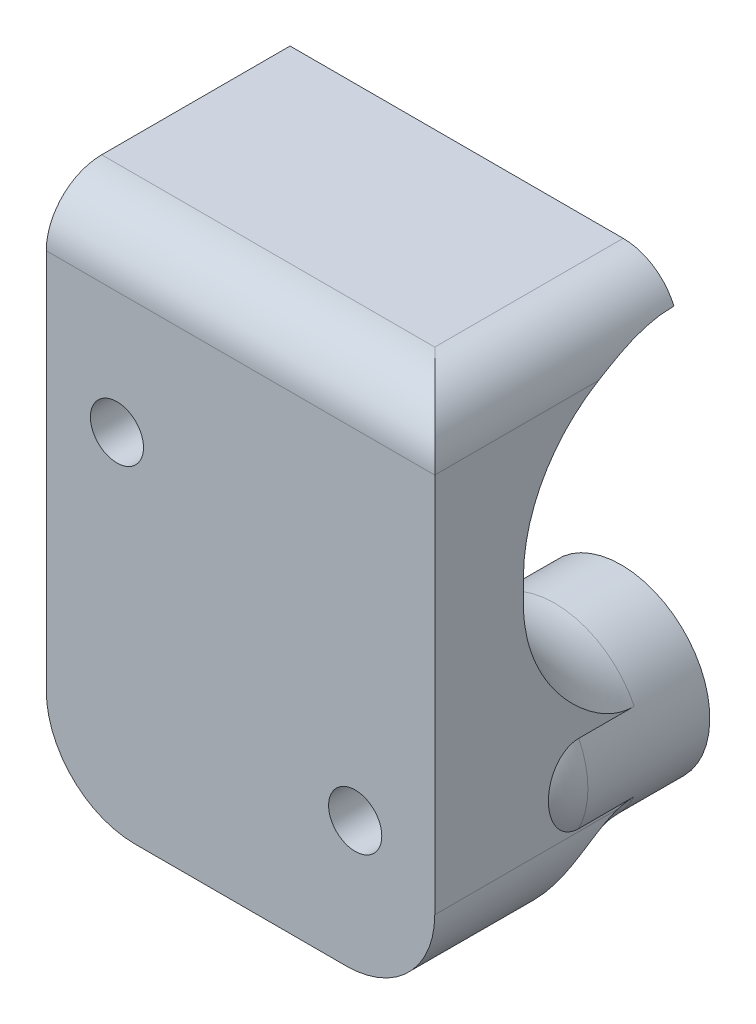
ISO-10303-21;
HEADER;
FILE_DESCRIPTION(('STEP AP214'),'2;1');
FILE_NAME('part.step','',(''),(''),'','','');
FILE_SCHEMA(('AUTOMOTIVE_DESIGN { 1 0 10303 214 1 1 1 1 }'));
ENDSEC;
DATA;
#1=APPLICATION_CONTEXT('core data for automotive mechanical design processes');
#2=APPLICATION_PROTOCOL_DEFINITION('international standard','automotive_design',2000,#1);
#3=PRODUCT_CONTEXT('',#1,'mechanical');
#4=PRODUCT('Part','Part','',(#3));
#5=PRODUCT_RELATED_PRODUCT_CATEGORY('part','',(#4));
#6=PRODUCT_DEFINITION_FORMATION('','',#4);
#7=PRODUCT_DEFINITION_CONTEXT('part definition',#1,'design');
#8=PRODUCT_DEFINITION('design','',#6,#7);
#9=PRODUCT_DEFINITION_SHAPE('','',#8);
#10=(LENGTH_UNIT() NAMED_UNIT(*) SI_UNIT(.MILLI.,.METRE.));
#11=(NAMED_UNIT(*) PLANE_ANGLE_UNIT() SI_UNIT($,.RADIAN.));
#12=(NAMED_UNIT(*) SI_UNIT($,.STERADIAN.) SOLID_ANGLE_UNIT());
#13=UNCERTAINTY_MEASURE_WITH_UNIT(LENGTH_MEASURE(1.E-05),#10,'distance_accuracy_value','');
#14=(GEOMETRIC_REPRESENTATION_CONTEXT(3) GLOBAL_UNCERTAINTY_ASSIGNED_CONTEXT((#13)) GLOBAL_UNIT_ASSIGNED_CONTEXT((#10,
#11,#12)) REPRESENTATION_CONTEXT('',''));
#15=CARTESIAN_POINT('',(0.,0.,0.));
#16=DIRECTION('',(0.,0.,1.));
#17=DIRECTION('',(1.,0.,0.));
#18=AXIS2_PLACEMENT_3D('',#15,#16,#17);
#19=CARTESIAN_POINT('',(0.,0.,4.));
#20=DIRECTION('',(0.,0.,-1.));
#21=DIRECTION('',(-1.,0.,0.));
#22=AXIS2_PLACEMENT_3D('',#19,#20,#21);
#23=PLANE('',#22);
#24=DIRECTION('',(0.,1.,0.));
#25=VECTOR('',#24,1.);
#26=CARTESIAN_POINT('',(19.7293652888547,1.24866858143758,4.));
#27=LINE('',#26,#25);
#28=CARTESIAN_POINT('',(19.7293652888547,5.24866858143758,4.));
#29=VERTEX_POINT('',#28);
#30=CARTESIAN_POINT('',(19.7293652888547,22.4296617706878,4.));
#31=VERTEX_POINT('',#30);
#32=EDGE_CURVE('E183',#29,#31,#27,.T.);
#33=ORIENTED_EDGE('',*,*,#32,.T.);
#34=DIRECTION('',(-1.,0.,0.));
#35=VECTOR('',#34,1.);
#36=CARTESIAN_POINT('',(0.,22.4296617706878,4.));
#37=LINE('',#36,#35);
#38=CARTESIAN_POINT('',(2.20085117670349,22.4296617706878,4.));
#39=VERTEX_POINT('',#38);
#40=EDGE_CURVE('E45',#31,#39,#37,.T.);
#41=ORIENTED_EDGE('',*,*,#40,.T.);
#42=DIRECTION('',(0.,-1.,0.));
#43=VECTOR('',#42,1.);
#44=CARTESIAN_POINT('',(2.20085117670349,1.24866858143758,4.));
#45=LINE('',#44,#43);
#46=CARTESIAN_POINT('',(2.20085117670349,5.24866858143758,4.));
#47=VERTEX_POINT('',#46);
#48=EDGE_CURVE('E177',#39,#47,#45,.T.);
#49=ORIENTED_EDGE('',*,*,#48,.T.);
#50=CARTESIAN_POINT('',(6.20085117670349,5.24866858143758,4.));
#51=DIRECTION('',(0.,0.,-1.));
#52=DIRECTION('',(-1.,0.,0.));
#53=AXIS2_PLACEMENT_3D('',#50,#51,#52);
#54=CIRCLE('',#53,4.);
#55=CARTESIAN_POINT('',(6.20085117670349,1.24866858143758,4.));
#56=VERTEX_POINT('',#55);
#57=EDGE_CURVE('E205',#47,#56,#54,.F.);
#58=ORIENTED_EDGE('',*,*,#57,.T.);
#59=DIRECTION('',(1.,0.,0.));
#60=VECTOR('',#59,1.);
#61=CARTESIAN_POINT('',(2.20085117670349,1.24866858143758,4.));
#62=LINE('',#61,#60);
#63=CARTESIAN_POINT('',(15.7293652888547,1.24866858143758,4.));
#64=VERTEX_POINT('',#63);
#65=EDGE_CURVE('E179',#56,#64,#62,.T.);
#66=ORIENTED_EDGE('',*,*,#65,.T.);
#67=CARTESIAN_POINT('',(15.7293652888547,5.24866858143758,4.));
#68=DIRECTION('',(0.,0.,-1.));
#69=DIRECTION('',(-1.,0.,0.));
#70=AXIS2_PLACEMENT_3D('',#67,#68,#69);
#71=CIRCLE('',#70,4.);
#72=EDGE_CURVE('E203',#64,#29,#71,.F.);
#73=ORIENTED_EDGE('',*,*,#72,.T.);
#74=EDGE_LOOP('',(#33,#41,#49,#58,#66,#73));
#75=FACE_BOUND('',#74,.T.);
#76=CARTESIAN_POINT('',(16.1393652888547,7.12966177068777,4.));
#77=DIRECTION('',(0.,0.,1.));
#78=DIRECTION('',(1.,0.,0.));
#79=AXIS2_PLACEMENT_3D('',#76,#77,#78);
#80=CIRCLE('',#79,1.2);
#81=CARTESIAN_POINT('',(17.3393652888547,7.12966177068777,4.));
#82=VERTEX_POINT('',#81);
#83=EDGE_CURVE('E171',#82,#82,#80,.T.);
#84=ORIENTED_EDGE('',*,*,#83,.F.);
#85=EDGE_LOOP('',(#84));
#86=FACE_BOUND('',#85,.T.);
#87=CARTESIAN_POINT('',(5.39085117670349,16.9296617706878,4.));
#88=DIRECTION('',(0.,0.,1.));
#89=DIRECTION('',(1.,0.,0.));
#90=AXIS2_PLACEMENT_3D('',#87,#88,#89);
#91=CIRCLE('',#90,1.19774028703024);
#92=CARTESIAN_POINT('',(6.58859146373373,16.9296617706878,4.));
#93=VERTEX_POINT('',#92);
#94=EDGE_CURVE('E165',#93,#93,#91,.T.);
#95=ORIENTED_EDGE('',*,*,#94,.F.);
#96=EDGE_LOOP('',(#95));
#97=FACE_BOUND('',#96,.T.);
#98=ADVANCED_FACE('F36',(#75,#86,#97),#23,.F.);
#99=CARTESIAN_POINT('',(0.,0.,0.));
#100=DIRECTION('',(0.,0.,-1.));
#101=DIRECTION('',(-1.,0.,0.));
#102=AXIS2_PLACEMENT_3D('',#99,#100,#101);
#103=PLANE('',#102);
#104=DIRECTION('',(0.,-1.,0.));
#105=VECTOR('',#104,1.);
#106=CARTESIAN_POINT('',(2.20085117670349,1.24866858143758,0.));
#107=LINE('',#106,#105);
#108=CARTESIAN_POINT('',(2.20085117670349,16.4296617706878,0.));
#109=VERTEX_POINT('',#108);
#110=CARTESIAN_POINT('',(2.20085117670349,5.24866858143758,0.));
#111=VERTEX_POINT('',#110);
#112=EDGE_CURVE('E174',#109,#111,#107,.T.);
#113=ORIENTED_EDGE('',*,*,#112,.F.);
#114=DIRECTION('',(-1.,0.,0.));
#115=VECTOR('',#114,1.);
#116=CARTESIAN_POINT('',(0.,16.4296617706878,0.));
#117=LINE('',#116,#115);
#118=CARTESIAN_POINT('',(4.30246622863811,16.4296617706878,0.));
#119=VERTEX_POINT('',#118);
#120=EDGE_CURVE('E151',#109,#119,#117,.F.);
#121=ORIENTED_EDGE('',*,*,#120,.T.);
#122=CARTESIAN_POINT('',(5.39085117670349,16.9296617706878,0.));
#123=DIRECTION('',(0.,0.,1.));
#124=DIRECTION('',(1.,0.,0.));
#125=AXIS2_PLACEMENT_3D('',#122,#123,#124);
#126=CIRCLE('',#125,1.19774028703024);
#127=CARTESIAN_POINT('',(6.47923612476887,16.4296617706878,0.));
#128=VERTEX_POINT('',#127);
#129=EDGE_CURVE('E161',#119,#128,#126,.T.);
#130=ORIENTED_EDGE('',*,*,#129,.T.);
#131=DIRECTION('',(-1.,0.,0.));
#132=VECTOR('',#131,1.);
#133=CARTESIAN_POINT('',(0.,16.4296617706878,0.));
#134=LINE('',#133,#132);
#135=CARTESIAN_POINT('',(19.7293652888547,16.4296617706878,0.));
#136=VERTEX_POINT('',#135);
#137=EDGE_CURVE('E266',#128,#136,#134,.F.);
#138=ORIENTED_EDGE('',*,*,#137,.T.);
#139=DIRECTION('',(0.,1.,0.));
#140=VECTOR('',#139,1.);
#141=CARTESIAN_POINT('',(19.7293652888547,1.24866858143758,0.));
#142=LINE('',#141,#140);
#143=CARTESIAN_POINT('',(19.7293652888547,15.3826551670258,0.));
#144=VERTEX_POINT('',#143);
#145=EDGE_CURVE('E180',#144,#136,#142,.T.);
#146=ORIENTED_EDGE('',*,*,#145,.F.);
#147=CARTESIAN_POINT('',(16.1393652888547,7.12966177068777,0.));
#148=DIRECTION('',(0.,0.,-1.));
#149=DIRECTION('',(-1.,0.,0.));
#150=AXIS2_PLACEMENT_3D('',#147,#148,#149);
#151=CIRCLE('',#150,9.);
#152=CARTESIAN_POINT('',(9.32658912138871,1.24866858143758,0.));
#153=VERTEX_POINT('',#152);
#154=EDGE_CURVE('E217',#144,#153,#151,.F.);
#155=ORIENTED_EDGE('',*,*,#154,.T.);
#156=DIRECTION('',(1.,0.,0.));
#157=VECTOR('',#156,1.);
#158=CARTESIAN_POINT('',(2.20085117670349,1.24866858143758,0.));
#159=LINE('',#158,#157);
#160=CARTESIAN_POINT('',(6.20085117670349,1.24866858143758,0.));
#161=VERTEX_POINT('',#160);
#162=EDGE_CURVE('E186',#161,#153,#159,.T.);
#163=ORIENTED_EDGE('',*,*,#162,.F.);
#164=CARTESIAN_POINT('',(6.20085117670349,5.24866858143758,0.));
#165=DIRECTION('',(0.,0.,-1.));
#166=DIRECTION('',(-1.,0.,0.));
#167=AXIS2_PLACEMENT_3D('',#164,#165,#166);
#168=CIRCLE('',#167,4.);
#169=EDGE_CURVE('E197',#161,#111,#168,.T.);
#170=ORIENTED_EDGE('',*,*,#169,.T.);
#171=EDGE_LOOP('',(#113,#121,#130,#138,#146,#155,#163,#170));
#172=FACE_BOUND('',#171,.T.);
#173=ADVANCED_FACE('F291',(#172),#103,.T.);
#174=CARTESIAN_POINT('',(2.20085117670349,1.24866858143758,4.));
#175=DIRECTION('',(1.,0.,0.));
#176=DIRECTION('',(0.,0.,-1.));
#177=AXIS2_PLACEMENT_3D('',#174,#175,#176);
#178=PLANE('',#177);
#179=ORIENTED_EDGE('',*,*,#48,.F.);
#180=CARTESIAN_POINT('',(2.20085117670349,22.4296617706878,1.5));
#181=DIRECTION('',(1.,0.,0.));
#182=DIRECTION('',(0.,0.,-1.));
#183=AXIS2_PLACEMENT_3D('',#180,#181,#182);
#184=CIRCLE('',#183,2.5);
#185=CARTESIAN_POINT('',(2.20085117670349,24.9296617706878,1.5));
#186=VERTEX_POINT('',#185);
#187=EDGE_CURVE('E11',#39,#186,#184,.F.);
#188=ORIENTED_EDGE('',*,*,#187,.T.);
#189=DIRECTION('',(0.,0.,-1.));
#190=VECTOR('',#189,1.);
#191=CARTESIAN_POINT('',(2.20085117670349,24.9296617706878,4.));
#192=LINE('',#191,#190);
#193=CARTESIAN_POINT('',(2.20085117670349,24.9296617706878,-7.));
#194=VERTEX_POINT('',#193);
#195=EDGE_CURVE('E158',#186,#194,#192,.T.);
#196=ORIENTED_EDGE('',*,*,#195,.T.);
#197=DIRECTION('',(0.,1.,0.));
#198=VECTOR('',#197,1.);
#199=CARTESIAN_POINT('',(2.20085117670349,24.9296617706878,-7.));
#200=LINE('',#199,#198);
#201=CARTESIAN_POINT('',(2.20085117670349,23.4296617706878,-7.));
#202=VERTEX_POINT('',#201);
#203=EDGE_CURVE('E140',#202,#194,#200,.T.);
#204=ORIENTED_EDGE('',*,*,#203,.F.);
#205=CARTESIAN_POINT('',(2.20085117670349,16.4296617706878,-7.));
#206=DIRECTION('',(1.,0.,0.));
#207=DIRECTION('',(0.,0.,-1.));
#208=AXIS2_PLACEMENT_3D('',#205,#206,#207);
#209=CIRCLE('',#208,7.);
#210=EDGE_CURVE('E148',#202,#109,#209,.T.);
#211=ORIENTED_EDGE('',*,*,#210,.T.);
#212=ORIENTED_EDGE('',*,*,#112,.T.);
#213=DIRECTION('',(0.,0.,-1.));
#214=VECTOR('',#213,1.);
#215=CARTESIAN_POINT('',(2.20085117670349,5.24866858143758,4.));
#216=LINE('',#215,#214);
#217=EDGE_CURVE('E200',#111,#47,#216,.F.);
#218=ORIENTED_EDGE('',*,*,#217,.T.);
#219=EDGE_LOOP('',(#179,#188,#196,#204,#211,#212,#218));
#220=FACE_BOUND('',#219,.T.);
#221=ADVANCED_FACE('F156',(#220),#178,.F.);
#222=CARTESIAN_POINT('',(2.20085117670349,1.24866858143758,4.));
#223=DIRECTION('',(0.,1.,0.));
#224=DIRECTION('',(0.,0.,1.));
#225=AXIS2_PLACEMENT_3D('',#222,#223,#224);
#226=PLANE('',#225);
#227=ORIENTED_EDGE('',*,*,#65,.F.);
#228=DIRECTION('',(0.,0.,-1.));
#229=VECTOR('',#228,1.);
#230=CARTESIAN_POINT('',(6.20085117670349,1.24866858143758,4.));
#231=LINE('',#230,#229);
#232=EDGE_CURVE('E194',#56,#161,#231,.T.);
#233=ORIENTED_EDGE('',*,*,#232,.T.);
#234=ORIENTED_EDGE('',*,*,#162,.T.);
#235=CARTESIAN_POINT('',(9.32658912138871,1.24866858143758,0.));
#236=CARTESIAN_POINT('',(9.54555628879853,1.24866858143758,4.20623398602795E-05));
#237=CARTESIAN_POINT('',(9.76435706845119,1.24866858143758,-0.00823480648782743));
#238=CARTESIAN_POINT('',(10.2005797246538,1.24866858143758,-0.039056109352053));
#239=CARTESIAN_POINT('',(10.4180033766736,1.24866858143758,-0.0615747778262042));
#240=CARTESIAN_POINT('',(10.8509060792367,1.24866858143758,-0.118484839648181));
#241=CARTESIAN_POINT('',(11.0663874936383,1.24866858143758,-0.152858958210626));
#242=CARTESIAN_POINT('',(11.4957606697991,1.24866858143758,-0.230884004024369));
#243=CARTESIAN_POINT('',(11.7096514194769,1.24866858143758,-0.274540388506163));
#244=CARTESIAN_POINT('',(12.0806091395052,1.24866858143758,-0.356015098310026));
#245=CARTESIAN_POINT('',(12.2379983971854,1.24866858143758,-0.392402354746776));
#246=CARTESIAN_POINT('',(12.5522707060738,1.24866858143758,-0.467309792661472));
#247=CARTESIAN_POINT('',(12.7091537377214,1.24866858143758,-0.505830055538854));
#248=CARTESIAN_POINT('',(13.0226320132369,1.24866858143758,-0.583486809110885));
#249=CARTESIAN_POINT('',(13.1792273867061,1.24866858143758,-0.622622786191575));
#250=CARTESIAN_POINT('',(13.4926914146475,1.24866858143758,-0.699877045574316));
#251=CARTESIAN_POINT('',(13.6495600975953,1.24866858143758,-0.737995214125289));
#252=CARTESIAN_POINT('',(13.9646465059077,1.24866858143758,-0.811492738592579));
#253=CARTESIAN_POINT('',(14.122867130177,1.24866858143758,-0.846859910175811));
#254=CARTESIAN_POINT('',(14.4402962832324,1.24866858143758,-0.912591306901972));
#255=CARTESIAN_POINT('',(14.5995043791527,1.24866858143758,-0.942957582773081));
#256=CARTESIAN_POINT('',(14.9197713752915,1.24866858143758,-0.996674459515918));
#257=CARTESIAN_POINT('',(15.0808350375287,1.24866858143758,-1.01999764297659));
#258=CARTESIAN_POINT('',(15.3233425081727,1.24866858143758,-1.04816159680771));
#259=CARTESIAN_POINT('',(15.4043935495477,1.24866858143758,-1.05641652724594));
#260=CARTESIAN_POINT('',(15.5667245444592,1.24866858143758,-1.07046616809496));
#261=CARTESIAN_POINT('',(15.6480045417261,1.24866858143758,-1.07626037117464));
#262=CARTESIAN_POINT('',(15.7293652888547,1.24866858143758,-1.08073512577365));
#263=B_SPLINE_CURVE_WITH_KNOTS('',3,(#235,#236,#237,#238,#239,#240,#241,#242,#243,#244,#245,
#246,#247,#248,#249,#250,#251,#252,#253,#254,#255,#256,#257,#258,#259,#260,#261,#262),
.UNSPECIFIED.,.F.,.F.,(4,2,2,2,2,2,2,2,2,2,2,2,2,4),(0.,0.656502651360714,1.31182097476802,
1.96618842850163,2.62094166706982,3.10554479689278,3.59016643282155,4.07440324732763,
4.5586939559018,5.04502009687463,5.53114630975148,6.01914122223986,6.26351807298325,
6.5079452827649),.UNSPECIFIED.);
#264=CARTESIAN_POINT('',(15.7293652888547,1.24866858143758,-1.08073512577365));
#265=VERTEX_POINT('',#264);
#266=EDGE_CURVE('E227',#153,#265,#263,.T.);
#267=ORIENTED_EDGE('',*,*,#266,.T.);
#268=DIRECTION('',(0.,0.,-1.));
#269=VECTOR('',#268,1.);
#270=CARTESIAN_POINT('',(15.7293652888547,1.24866858143758,4.));
#271=LINE('',#270,#269);
#272=EDGE_CURVE('E192',#265,#64,#271,.F.);
#273=ORIENTED_EDGE('',*,*,#272,.T.);
#274=EDGE_LOOP('',(#227,#233,#234,#267,#273));
#275=FACE_BOUND('',#274,.T.);
#276=ADVANCED_FACE('F299',(#275),#226,.F.);
#277=CARTESIAN_POINT('',(19.7293652888547,1.24866858143758,4.));
#278=DIRECTION('',(-1.,0.,0.));
#279=DIRECTION('',(0.,0.,1.));
#280=AXIS2_PLACEMENT_3D('',#277,#278,#279);
#281=PLANE('',#280);
#282=CARTESIAN_POINT('',(19.7293652888547,16.4296617706878,-7.));
#283=DIRECTION('',(-1.,0.,0.));
#284=DIRECTION('',(0.,0.,1.));
#285=AXIS2_PLACEMENT_3D('',#282,#283,#284);
#286=CIRCLE('',#285,7.);
#287=CARTESIAN_POINT('',(19.7293652888547,22.4296617706878,-3.39444872453601));
#288=VERTEX_POINT('',#287);
#289=EDGE_CURVE('E275',#136,#288,#286,.T.);
#290=ORIENTED_EDGE('',*,*,#289,.T.);
#291=DIRECTION('',(0.,0.,-1.));
#292=VECTOR('',#291,1.);
#293=CARTESIAN_POINT('',(19.7293652888547,22.4296617706878,4.));
#294=LINE('',#293,#292);
#295=EDGE_CURVE('E59',#288,#31,#294,.F.);
#296=ORIENTED_EDGE('',*,*,#295,.T.);
#297=ORIENTED_EDGE('',*,*,#32,.F.);
#298=DIRECTION('',(0.,0.,-1.));
#299=VECTOR('',#298,1.);
#300=CARTESIAN_POINT('',(19.7293652888547,5.24866858143758,4.));
#301=LINE('',#300,#299);
#302=CARTESIAN_POINT('',(19.7293652888547,5.24866858143758,-4.27440311544236));
#303=VERTEX_POINT('',#302);
#304=EDGE_CURVE('E207',#29,#303,#301,.T.);
#305=ORIENTED_EDGE('',*,*,#304,.T.);
#306=CARTESIAN_POINT('',(19.7293652888547,5.24866858143758,-4.27440311544236));
#307=CARTESIAN_POINT('',(19.7293652888547,5.2672559076425,-4.33318068845502));
#308=CARTESIAN_POINT('',(19.7293652888547,5.28393120337881,-4.39259549726452));
#309=CARTESIAN_POINT('',(19.7293652888547,5.31289901896801,-4.51210667490693));
#310=CARTESIAN_POINT('',(19.7293652888547,5.32521689843051,-4.572196927296));
#311=CARTESIAN_POINT('',(19.7293652888547,5.3451442158191,-4.69317974423206));
#312=CARTESIAN_POINT('',(19.7293652888547,5.35275270791755,-4.75407246743996));
#313=CARTESIAN_POINT('',(19.7293652888547,5.36301550366716,-4.87663577129248));
#314=CARTESIAN_POINT('',(19.7293652888547,5.36564005702666,-4.93830882447122));
#315=CARTESIAN_POINT('',(19.7293652888547,5.36560394850595,-5.00000000000008));
#316=B_SPLINE_CURVE_WITH_KNOTS('',3,(#306,#307,#308,#309,#310,#311,#312,#313,#314,#315),
.UNSPECIFIED.,.F.,.F.,(4,2,2,2,4),(0.,0.184953075098565,0.368811317016596,0.552706472829413,
0.737695932796255),.UNSPECIFIED.);
#317=CARTESIAN_POINT('',(19.7293652888547,5.3656039485062,-5.));
#318=VERTEX_POINT('',#317);
#319=EDGE_CURVE('E259',#303,#318,#316,.T.);
#320=ORIENTED_EDGE('',*,*,#319,.T.);
#321=DIRECTION('',(0.,0.,1.));
#322=VECTOR('',#321,1.);
#323=CARTESIAN_POINT('',(19.7293652888547,5.3656039485062,0.));
#324=LINE('',#323,#322);
#325=CARTESIAN_POINT('',(19.7293652888547,5.3656039485062,-2.5));
#326=VERTEX_POINT('',#325);
#327=EDGE_CURVE('E209',#326,#318,#324,.F.);
#328=ORIENTED_EDGE('',*,*,#327,.F.);
#329=CARTESIAN_POINT('',(19.7293652888547,5.3656039485062,-2.5));
#330=CARTESIAN_POINT('',(19.7293652888547,5.36559865556175,-2.46229175998775));
#331=CARTESIAN_POINT('',(19.7293652888547,5.36754038245088,-2.4246102752985));
#332=CARTESIAN_POINT('',(19.7293652888547,5.37524195353578,-2.34966535888322));
#333=CARTESIAN_POINT('',(19.7293652888547,5.38099914258456,-2.31240165475239));
#334=CARTESIAN_POINT('',(19.7293652888547,5.40374538918709,-2.20237630310146));
#335=CARTESIAN_POINT('',(19.7293652888547,5.42621236156184,-2.13068206071386));
#336=CARTESIAN_POINT('',(19.7293652888547,5.48415536722237,-1.99306802319238));
#337=CARTESIAN_POINT('',(19.7293652888547,5.5196040587472,-1.92713644978367));
#338=CARTESIAN_POINT('',(19.7293652888547,5.6014326249231,-1.80238203032851));
#339=CARTESIAN_POINT('',(19.7293652888547,5.64782789157216,-1.74356937200913));
#340=CARTESIAN_POINT('',(19.7293652888547,5.74730039013117,-1.63618346307512));
#341=CARTESIAN_POINT('',(19.7293652888547,5.80004817125829,-1.58730127190067));
#342=CARTESIAN_POINT('',(19.7293652888547,5.91172413351117,-1.49725432143782));
#343=CARTESIAN_POINT('',(19.7293652888547,5.97065436910791,-1.45609214030841));
#344=CARTESIAN_POINT('',(19.7293652888547,6.12415088243007,-1.36252307465462));
#345=CARTESIAN_POINT('',(19.7293652888547,6.22167460334327,-1.31494778787668));
#346=CARTESIAN_POINT('',(19.7293652888547,6.42311763178275,-1.23625388641613));
#347=CARTESIAN_POINT('',(19.7293652888547,6.52704469907529,-1.20515569511546));
#348=CARTESIAN_POINT('',(19.7293652888547,6.71419155032046,-1.16379973889964));
#349=CARTESIAN_POINT('',(19.7293652888547,6.79674222557573,-1.15041001578762));
#350=CARTESIAN_POINT('',(19.7293652888547,6.96274075819934,-1.13260204409007));
#351=CARTESIAN_POINT('',(19.7293652888547,7.04618803369664,-1.12817829314361));
#352=CARTESIAN_POINT('',(19.7293652888547,7.24619644301057,-1.12817374789229));
#353=CARTESIAN_POINT('',(19.7293652888547,7.36278268863695,-1.13678926853371));
#354=CARTESIAN_POINT('',(19.7293652888547,7.59353832414797,-1.17168674638339));
#355=CARTESIAN_POINT('',(19.7293652888547,7.70770287034339,-1.19800119281276));
#356=CARTESIAN_POINT('',(19.7293652888547,7.9311072443394,-1.26970131442237));
#357=CARTESIAN_POINT('',(19.7293652888547,8.04029545507909,-1.31525126996584));
#358=CARTESIAN_POINT('',(19.7293652888547,8.24766351986045,-1.42671029809274));
#359=CARTESIAN_POINT('',(19.7293652888547,8.34587941021617,-1.49254988457889));
#360=CARTESIAN_POINT('',(19.7293652888547,8.49240150863878,-1.61728976094126));
#361=CARTESIAN_POINT('',(19.7293652888547,8.54591801678643,-1.67010037032794));
#362=CARTESIAN_POINT('',(19.7293652888547,8.64371313682637,-1.78376233491642));
#363=CARTESIAN_POINT('',(19.7293652888547,8.68799454630481,-1.84461124592729));
#364=CARTESIAN_POINT('',(19.7293652888547,8.76534711277782,-1.97380736493008));
#365=CARTESIAN_POINT('',(19.7293652888547,8.79832203213034,-2.04221269402204));
#366=CARTESIAN_POINT('',(19.7293652888547,8.85034509371521,-2.18408914858955));
#367=CARTESIAN_POINT('',(19.7293652888547,8.86942427549188,-2.25754857993438));
#368=CARTESIAN_POINT('',(19.7293652888547,8.88514980371624,-2.35985901750131));
#369=CARTESIAN_POINT('',(19.7293652888547,8.88836114827594,-2.38780653090368));
#370=CARTESIAN_POINT('',(19.7293652888547,8.89264400875459,-2.4438304179339));
#371=CARTESIAN_POINT('',(19.7293652888547,8.89371815155329,-2.47190659080516));
#372=CARTESIAN_POINT('',(19.7293652888547,8.89371959286934,-2.5));
#373=B_SPLINE_CURVE_WITH_KNOTS('',3,(#329,#330,#331,#332,#333,#334,#335,#336,#337,#338,#339,
#340,#341,#342,#343,#344,#345,#346,#347,#348,#349,#350,#351,#352,#353,#354,#355,#356,#357,#358,
#359,#360,#361,#362,#363,#364,#365,#366,#367,#368,#369,#370,#371,#372),.UNSPECIFIED.,.F.,.F.,(4,
2,2,2,2,2,2,2,2,2,2,2,2,2,2,2,2,2,2,2,2,4),(0.,0.113023541465304,0.225968513301273,
0.449801771456623,0.673166283933967,0.896846761302061,1.11184092690144,1.32690676416771,
1.65067147605876,1.97483656144969,2.22524018411685,2.47549008906273,2.82485495187783,
3.17486288667791,3.5279225175172,3.87978621189116,4.10450163286267,4.3291488816514,
4.55566337298336,4.7816703235985,4.86599973739737,4.95022543594715),.UNSPECIFIED.);
#374=CARTESIAN_POINT('',(19.7293652888547,8.89371959286934,-2.5));
#375=VERTEX_POINT('',#374);
#376=EDGE_CURVE('E308',#326,#375,#373,.T.);
#377=ORIENTED_EDGE('',*,*,#376,.T.);
#378=DIRECTION('',(0.,0.,1.));
#379=VECTOR('',#378,1.);
#380=CARTESIAN_POINT('',(19.7293652888547,8.89371959286934,-5.));
#381=LINE('',#380,#379);
#382=CARTESIAN_POINT('',(19.7293652888547,8.89371959286934,-5.));
#383=VERTEX_POINT('',#382);
#384=EDGE_CURVE('E214',#383,#375,#381,.T.);
#385=ORIENTED_EDGE('',*,*,#384,.F.);
#386=CARTESIAN_POINT('',(19.7293652888547,8.89371959286934,-5.));
#387=CARTESIAN_POINT('',(19.7293652888547,8.89364301925233,-4.92460021251954));
#388=CARTESIAN_POINT('',(19.7293652888547,8.89758551115703,-4.84925345225248));
#389=CARTESIAN_POINT('',(19.7293652888547,8.91288921547295,-4.69951432485127));
#390=CARTESIAN_POINT('',(19.7293652888547,8.92423033782026,-4.62511992786985));
#391=CARTESIAN_POINT('',(19.7293652888547,8.95346943894661,-4.47896158581907));
#392=CARTESIAN_POINT('',(19.7293652888547,8.97125365683458,-4.40717443885473));
#393=CARTESIAN_POINT('',(19.7293652888547,9.01254448578314,-4.26523022076777));
#394=CARTESIAN_POINT('',(19.7293652888547,9.03605550979904,-4.19507445264126));
#395=CARTESIAN_POINT('',(19.7293652888547,9.10234849721785,-4.01811130838519));
#396=CARTESIAN_POINT('',(19.7293652888547,9.1485796025416,-3.91259763413481));
#397=CARTESIAN_POINT('',(19.7293652888547,9.25000239337249,-3.70599543932268));
#398=CARTESIAN_POINT('',(19.7293652888547,9.30519929247468,-3.60490953718997));
#399=CARTESIAN_POINT('',(19.7293652888547,9.42315451646952,-3.40587319219729));
#400=CARTESIAN_POINT('',(19.7293652888547,9.48598495180078,-3.30796583668873));
#401=CARTESIAN_POINT('',(19.7293652888547,9.61738210096188,-3.11605219354622));
#402=CARTESIAN_POINT('',(19.7293652888547,9.68595103032272,-3.02204743378607));
#403=CARTESIAN_POINT('',(19.7293652888547,9.82292456404232,-2.84419824107379));
#404=CARTESIAN_POINT('',(19.7293652888547,9.89100498694856,-2.76010311211643));
#405=CARTESIAN_POINT('',(19.7293652888547,10.0308369473192,-2.59501546278309));
#406=CARTESIAN_POINT('',(19.7293652888547,10.1025890278068,-2.51402340445414));
#407=CARTESIAN_POINT('',(19.7293652888547,10.3228909674194,-2.27555858175605));
#408=CARTESIAN_POINT('',(19.7293652888547,10.4764373061268,-2.12266025145538));
#409=CARTESIAN_POINT('',(19.7293652888547,10.7947480707694,-1.82981380874729));
#410=CARTESIAN_POINT('',(19.7293652888547,10.959487404902,-1.68983828796905));
#411=CARTESIAN_POINT('',(19.7293652888547,11.2995094118409,-1.42342358610706));
#412=CARTESIAN_POINT('',(19.7293652888547,11.4747887640181,-1.29698017627297));
#413=CARTESIAN_POINT('',(19.7293652888547,11.8397269202788,-1.05584957151071));
#414=CARTESIAN_POINT('',(19.7293652888547,12.0296380566394,-0.941543150523257));
#415=CARTESIAN_POINT('',(19.7293652888547,12.4188653301011,-0.730083430294715));
#416=CARTESIAN_POINT('',(19.7293652888547,12.6181834731566,-0.632933810712045));
#417=CARTESIAN_POINT('',(19.7293652888547,13.0244561389195,-0.457793684415574));
#418=CARTESIAN_POINT('',(19.7293652888547,13.2313882087007,-0.379751341009811));
#419=CARTESIAN_POINT('',(19.7293652888547,13.6517684214559,-0.2442409159294));
#420=CARTESIAN_POINT('',(19.7293652888547,13.8652125253022,-0.186760351351234));
#421=CARTESIAN_POINT('',(19.7293652888547,14.29464480135,-0.0944090740854767));
#422=CARTESIAN_POINT('',(19.7293652888547,14.5105818521013,-0.059304636189715));
#423=CARTESIAN_POINT('',(19.7293652888547,14.8364372230198,-0.0238970837492102));
#424=CARTESIAN_POINT('',(19.7293652888547,14.9454708814828,-0.0149691914978844));
#425=CARTESIAN_POINT('',(19.7293652888547,15.1638793954763,-0.00301984849332138));
#426=CARTESIAN_POINT('',(19.7293652888547,15.2732543072175,5.71472003259512E-07));
#427=CARTESIAN_POINT('',(19.7293652888547,15.3826551670259,0.));
#428=B_SPLINE_CURVE_WITH_KNOTS('',3,(#386,#387,#388,#389,#390,#391,#392,#393,#394,#395,#396,
#397,#398,#399,#400,#401,#402,#403,#404,#405,#406,#407,#408,#409,#410,#411,#412,#413,#414,#415,
#416,#417,#418,#419,#420,#421,#422,#423,#424,#425,#426,#427),.UNSPECIFIED.,.F.,.F.,(4,2,2,2,2,2,
2,2,2,2,2,2,2,2,2,2,2,2,2,2,4),(0.,0.226011675215953,0.451412183947183,0.673012814658969,
0.894784749350501,1.23977776570157,1.58497211789534,1.93372646398525,2.28261608467767,
2.60709465894717,2.93162136176051,3.58091402609372,4.22879633119635,4.87647557987658,
5.54062689127878,6.2049204721994,6.86739138925094,7.52945943982023,8.18449349563957,
8.51254913335402,8.84066200800705),.UNSPECIFIED.);
#429=EDGE_CURVE('E219',#383,#144,#428,.T.);
#430=ORIENTED_EDGE('',*,*,#429,.T.);
#431=ORIENTED_EDGE('',*,*,#145,.T.);
#432=EDGE_LOOP('',(#290,#296,#297,#305,#320,#328,#377,#385,#430,#431));
#433=FACE_BOUND('',#432,.T.);
#434=ADVANCED_FACE('F234',(#433),#281,.F.);
#435=CARTESIAN_POINT('',(2.20085117670349,24.9296617706878,4.));
#436=DIRECTION('',(0.,-1.,0.));
#437=DIRECTION('',(0.,0.,-1.));
#438=AXIS2_PLACEMENT_3D('',#435,#436,#437);
#439=PLANE('',#438);
#440=DIRECTION('',(-1.,0.,0.));
#441=VECTOR('',#440,1.);
#442=CARTESIAN_POINT('',(2.20085117670349,24.9296617706878,1.5));
#443=LINE('',#442,#441);
#444=CARTESIAN_POINT('',(17.2293652888547,24.9296617706878,1.5));
#445=VERTEX_POINT('',#444);
#446=EDGE_CURVE('E302',#186,#445,#443,.F.);
#447=ORIENTED_EDGE('',*,*,#446,.T.);
#448=DIRECTION('',(0.,0.,-1.));
#449=VECTOR('',#448,1.);
#450=CARTESIAN_POINT('',(17.2293652888547,24.9296617706878,4.));
#451=LINE('',#450,#449);
#452=CARTESIAN_POINT('',(17.2293652888547,24.9296617706878,-7.));
#453=VERTEX_POINT('',#452);
#454=EDGE_CURVE('E305',#445,#453,#451,.T.);
#455=ORIENTED_EDGE('',*,*,#454,.T.);
#456=DIRECTION('',(1.,0.,0.));
#457=VECTOR('',#456,1.);
#458=CARTESIAN_POINT('',(19.7293652888547,24.9296617706878,-7.));
#459=LINE('',#458,#457);
#460=EDGE_CURVE('E159',#194,#453,#459,.T.);
#461=ORIENTED_EDGE('',*,*,#460,.F.);
#462=ORIENTED_EDGE('',*,*,#195,.F.);
#463=EDGE_LOOP('',(#447,#455,#461,#462));
#464=FACE_BOUND('',#463,.T.);
#465=ADVANCED_FACE('F287',(#464),#439,.F.);
#466=CARTESIAN_POINT('',(16.1393652888547,7.12966177068777,4.));
#467=DIRECTION('',(0.,0.,-1.));
#468=DIRECTION('',(-1.,0.,0.));
#469=AXIS2_PLACEMENT_3D('',#466,#467,#468);
#470=CYLINDRICAL_SURFACE('',#469,1.2);
#471=ORIENTED_EDGE('',*,*,#83,.T.);
#472=EDGE_LOOP('',(#471));
#473=FACE_BOUND('',#472,.T.);
#474=CARTESIAN_POINT('',(16.1393652888547,7.12966177068777,0.));
#475=DIRECTION('',(0.,0.,1.));
#476=DIRECTION('',(1.,0.,0.));
#477=AXIS2_PLACEMENT_3D('',#474,#475,#476);
#478=CIRCLE('',#477,1.2);
#479=CARTESIAN_POINT('',(17.3393652888547,7.12966177068777,0.));
#480=VERTEX_POINT('',#479);
#481=EDGE_CURVE('E168',#480,#480,#478,.T.);
#482=ORIENTED_EDGE('',*,*,#481,.F.);
#483=EDGE_LOOP('',(#482));
#484=FACE_BOUND('',#483,.T.);
#485=ADVANCED_FACE('F282',(#473,#484),#470,.F.);
#486=CARTESIAN_POINT('',(5.39085117670349,16.9296617706878,4.));
#487=DIRECTION('',(0.,0.,-1.));
#488=DIRECTION('',(-1.,0.,0.));
#489=AXIS2_PLACEMENT_3D('',#486,#487,#488);
#490=CYLINDRICAL_SURFACE('',#489,1.19774028703024);
#491=ORIENTED_EDGE('',*,*,#94,.T.);
#492=EDGE_LOOP('',(#491));
#493=FACE_BOUND('',#492,.T.);
#494=ORIENTED_EDGE('',*,*,#129,.F.);
#495=CARTESIAN_POINT('',(4.30246622863811,16.4296617706878,0.));
#496=CARTESIAN_POINT('',(4.28855322323323,16.4599472482295,8.50154437618516E-07));
#497=CARTESIAN_POINT('',(4.27591159417968,16.4907996327847,-0.000196843830647522));
#498=CARTESIAN_POINT('',(4.25324315725985,16.5534432490994,-0.00102446522954967));
#499=CARTESIAN_POINT('',(4.24321623559767,16.5852344399337,-0.00165437382841926));
#500=CARTESIAN_POINT('',(4.21719895551848,16.6815982561826,-0.00424167900104052));
#501=CARTESIAN_POINT('',(4.20521547817513,16.7472846983421,-0.00689637209898505));
#502=CARTESIAN_POINT('',(4.19230753143667,16.8796253223667,-0.0141619296005169));
#503=CARTESIAN_POINT('',(4.19138843729664,16.9462799588545,-0.0187737436787126));
#504=CARTESIAN_POINT('',(4.20056583195017,17.0786674811559,-0.0298348945987759));
#505=CARTESIAN_POINT('',(4.21066102452234,17.1444004745116,-0.0362840151503968));
#506=CARTESIAN_POINT('',(4.24157892848181,17.2734319845799,-0.0507346338309302));
#507=CARTESIAN_POINT('',(4.2624508014701,17.3367179036076,-0.0587431404525884));
#508=CARTESIAN_POINT('',(4.31431322456373,17.4588610270006,-0.0757992374554917));
#509=CARTESIAN_POINT('',(4.34530653210096,17.5177170191165,-0.0848471105605014));
#510=CARTESIAN_POINT('',(4.41719195347426,17.6304604025256,-0.103521954941821));
#511=CARTESIAN_POINT('',(4.45825155148028,17.6842398157397,-0.113156399605584));
#512=CARTESIAN_POINT('',(4.54885675805429,17.7841651903746,-0.132110091083772));
#513=CARTESIAN_POINT('',(4.59840244265747,17.830311083392,-0.141429335073108));
#514=CARTESIAN_POINT('',(4.70508004159698,17.9140040887512,-0.159051568654178));
#515=CARTESIAN_POINT('',(4.7622665341049,17.9514834780504,-0.167346332918552));
#516=CARTESIAN_POINT('',(4.88236607046749,18.0162516852139,-0.18209407440826));
#517=CARTESIAN_POINT('',(4.94527852255335,18.0435415546648,-0.188547241675285));
#518=CARTESIAN_POINT('',(5.07383581222423,18.086638270768,-0.198903430436837));
#519=CARTESIAN_POINT('',(5.139409677483,18.1026459112612,-0.202850912949507));
#520=CARTESIAN_POINT('',(5.27241489643206,18.1234301751894,-0.207999837859835));
#521=CARTESIAN_POINT('',(5.3398459046934,18.1282088731265,-0.209201787482504));
#522=CARTESIAN_POINT('',(5.47285771158911,18.1263952060701,-0.208748655987566));
#523=CARTESIAN_POINT('',(5.53844276949505,18.1200830402111,-0.207163975369674));
#524=CARTESIAN_POINT('',(5.66758383260403,18.0968401518012,-0.201422389627117));
#525=CARTESIAN_POINT('',(5.73113982555022,18.0799093651199,-0.197265468967569));
#526=CARTESIAN_POINT('',(5.85446697396127,18.0359745725735,-0.186758092114968));
#527=CARTESIAN_POINT('',(5.91423813931779,18.008970593036,-0.180407641654991));
#528=CARTESIAN_POINT('',(6.02843743775992,17.9456973961407,-0.166063775899872));
#529=CARTESIAN_POINT('',(6.0828649790798,17.9094271542132,-0.15807017894132));
#530=CARTESIAN_POINT('',(6.18627081319892,17.8276267962132,-0.140883565783264));
#531=CARTESIAN_POINT('',(6.23508238769655,17.7818910855171,-0.131665908129831));
#532=CARTESIAN_POINT('',(6.32441411188055,17.6829775829166,-0.112930259519707));
#533=CARTESIAN_POINT('',(6.36493268235521,17.6297983768104,-0.103412211758188));
#534=CARTESIAN_POINT('',(6.43729226722522,17.5163107774274,-0.0846142670689012));
#535=CARTESIAN_POINT('',(6.46895176807197,17.4558851237938,-0.0753424494654096));
#536=CARTESIAN_POINT('',(6.52160665111137,17.3304130998995,-0.0579070813241943));
#537=CARTESIAN_POINT('',(6.54260402059272,17.2653675933002,-0.0497433244657216));
#538=CARTESIAN_POINT('',(6.57316898685357,17.1328822426843,-0.035095660854408));
#539=CARTESIAN_POINT('',(6.58280598718199,17.0654595567586,-0.0286017452824133));
#540=CARTESIAN_POINT('',(6.59051702859464,16.9297970134477,-0.017558060904679));
#541=CARTESIAN_POINT('',(6.58859125707207,16.8615571693237,-0.013008260592722));
#542=CARTESIAN_POINT('',(6.5737069851826,16.7310936782502,-0.00621013506975569));
#543=CARTESIAN_POINT('',(6.56154361730818,16.6687875633715,-0.00382103322760726));
#544=CARTESIAN_POINT('',(6.53604584733514,16.5773595328686,-0.00149137835381556));
#545=CARTESIAN_POINT('',(6.52632918814449,16.5472032438267,-0.00092386581113199));
#546=CARTESIAN_POINT('',(6.50453665339227,16.4877473332585,-0.000177779506238585));
#547=CARTESIAN_POINT('',(6.49246056088974,16.4584477907918,7.58472877333694E-07));
#548=CARTESIAN_POINT('',(6.47923612476887,16.4296617706878,0.));
#549=B_SPLINE_CURVE_WITH_KNOTS('',3,(#495,#496,#497,#498,#499,#500,#501,#502,#503,#504,#505,
#506,#507,#508,#509,#510,#511,#512,#513,#514,#515,#516,#517,#518,#519,#520,#521,#522,#523,#524,
#525,#526,#527,#528,#529,#530,#531,#532,#533,#534,#535,#536,#537,#538,#539,#540,#541,#542,#543,
#544,#545,#546,#547,#548),.UNSPECIFIED.,.F.,.F.,(4,2,2,2,2,2,2,2,2,2,2,2,2,2,2,2,2,2,2,2,2,2,2,
2,2,2,4),(0.,0.0999243387019121,0.199844327824122,0.39928175445764,0.598816067088601,
0.798326899964926,0.998756019762157,1.19923978906042,1.4033173757309,1.60739679102886,
1.81302077771837,2.01862353757473,2.22046781381704,2.42227479720857,2.61905637871854,
2.8158391486901,3.01262140434812,3.20942542762154,3.41106427601792,3.61274148623927,
3.81829026245251,4.02380071285428,4.22804902856705,4.4322940341181,4.6219996924099,
4.71697517432018,4.81195939297942),.UNSPECIFIED.);
#550=EDGE_CURVE('E154',#119,#128,#549,.T.);
#551=ORIENTED_EDGE('',*,*,#550,.T.);
#552=EDGE_LOOP('',(#494,#551));
#553=FACE_BOUND('',#552,.T.);
#554=ADVANCED_FACE('F277',(#493,#553),#490,.F.);
#555=CARTESIAN_POINT('',(0.,0.,-7.));
#556=DIRECTION('',(0.,0.,-1.));
#557=DIRECTION('',(-1.,0.,0.));
#558=AXIS2_PLACEMENT_3D('',#555,#556,#557);
#559=PLANE('',#558);
#560=ORIENTED_EDGE('',*,*,#460,.T.);
#561=CARTESIAN_POINT('',(17.2293652888547,22.4296617706878,-7.));
#562=DIRECTION('',(0.,0.,-1.));
#563=DIRECTION('',(-1.,0.,0.));
#564=AXIS2_PLACEMENT_3D('',#561,#562,#563);
#565=CIRCLE('',#564,2.5);
#566=CARTESIAN_POINT('',(19.5206531363326,23.4296617706878,-7.));
#567=VERTEX_POINT('',#566);
#568=EDGE_CURVE('E142',#453,#567,#565,.T.);
#569=ORIENTED_EDGE('',*,*,#568,.T.);
#570=DIRECTION('',(-1.,0.,0.));
#571=VECTOR('',#570,1.);
#572=CARTESIAN_POINT('',(19.7293652888547,23.4296617706878,-7.));
#573=LINE('',#572,#571);
#574=EDGE_CURVE('E135',#567,#202,#573,.T.);
#575=ORIENTED_EDGE('',*,*,#574,.T.);
#576=ORIENTED_EDGE('',*,*,#203,.T.);
#577=EDGE_LOOP('',(#560,#569,#575,#576));
#578=FACE_BOUND('',#577,.T.);
#579=ADVANCED_FACE('F138',(#578),#559,.T.);
#580=CARTESIAN_POINT('',(6.20085117670349,5.24866858143758,4.));
#581=DIRECTION('',(0.,0.,-1.));
#582=DIRECTION('',(-1.,0.,0.));
#583=AXIS2_PLACEMENT_3D('',#580,#581,#582);
#584=CYLINDRICAL_SURFACE('',#583,4.);
#585=ORIENTED_EDGE('',*,*,#57,.F.);
#586=ORIENTED_EDGE('',*,*,#217,.F.);
#587=ORIENTED_EDGE('',*,*,#169,.F.);
#588=ORIENTED_EDGE('',*,*,#232,.F.);
#589=EDGE_LOOP('',(#585,#586,#587,#588));
#590=FACE_BOUND('',#589,.T.);
#591=ADVANCED_FACE('F351',(#590),#584,.T.);
#592=CARTESIAN_POINT('',(15.7293652888547,5.24866858143758,4.));
#593=DIRECTION('',(0.,0.,-1.));
#594=DIRECTION('',(-1.,0.,0.));
#595=AXIS2_PLACEMENT_3D('',#592,#593,#594);
#596=CYLINDRICAL_SURFACE('',#595,4.);
#597=ORIENTED_EDGE('',*,*,#72,.F.);
#598=ORIENTED_EDGE('',*,*,#272,.F.);
#599=CARTESIAN_POINT('',(15.7293652888547,1.24866858143758,-1.08073512577365));
#600=CARTESIAN_POINT('',(15.8386949363449,1.24865434179407,-1.0867623522214));
#601=CARTESIAN_POINT('',(15.9479576821293,1.2531502968109,-1.09395884645899));
#602=CARTESIAN_POINT('',(16.1655578342097,1.27102835209623,-1.11077589136343));
#603=CARTESIAN_POINT('',(16.2738953096235,1.28440978263329,-1.12039625929996));
#604=CARTESIAN_POINT('',(16.4887496335911,1.31990468141564,-1.14213526613234));
#605=CARTESIAN_POINT('',(16.595268386535,1.34200834640363,-1.15425109300192));
#606=CARTESIAN_POINT('',(16.8058438145487,1.39471327199159,-1.18110098189139));
#607=CARTESIAN_POINT('',(16.909900509653,1.4253144634186,-1.19583502259772));
#608=CARTESIAN_POINT('',(17.1148296278272,1.49471141774608,-1.22805825194492));
#609=CARTESIAN_POINT('',(17.2157013815058,1.53350889028531,-1.24554801520029));
#610=CARTESIAN_POINT('',(17.4135589076679,1.61891565567814,-1.28344283261164));
#611=CARTESIAN_POINT('',(17.5105432208174,1.66552784874739,-1.30384896868169));
#612=CARTESIAN_POINT('',(17.6998742990316,1.76605775539636,-1.34774036214191));
#613=CARTESIAN_POINT('',(17.7922226638349,1.81997292483636,-1.37122454713959));
#614=CARTESIAN_POINT('',(17.9716877089486,1.93455866972495,-1.42147436865974));
#615=CARTESIAN_POINT('',(18.0588043302493,1.99522932134766,-1.44824004218428));
#616=CARTESIAN_POINT('',(18.2277965461309,2.12310565669993,-1.50546056263711));
#617=CARTESIAN_POINT('',(18.3096330548582,2.19035245547704,-1.53593895685326));
#618=CARTESIAN_POINT('',(18.4668714222,2.33025644206179,-1.60066642649281));
#619=CARTESIAN_POINT('',(18.5422760505075,2.40291127556594,-1.63491386419331));
#620=CARTESIAN_POINT('',(18.6862864793178,2.55285217169389,-1.70746242337037));
#621=CARTESIAN_POINT('',(18.7548895852039,2.63014005052635,-1.74576513913195));
#622=CARTESIAN_POINT('',(18.8849024565811,2.78837055705564,-1.82667321517181));
#623=CARTESIAN_POINT('',(18.9463147387759,2.86931189226144,-1.86927706032523));
#624=CARTESIAN_POINT('',(19.0625797729213,3.03505732911872,-1.95973641157866));
#625=CARTESIAN_POINT('',(19.1173250134774,3.11990032927403,-2.007658861658));
#626=CARTESIAN_POINT('',(19.2190983053089,3.29119864189806,-2.10855424203164));
#627=CARTESIAN_POINT('',(19.2661262101838,3.37765398491884,-2.161527268107));
#628=CARTESIAN_POINT('',(19.3525466287432,3.55103822153364,-2.27290372010547));
#629=CARTESIAN_POINT('',(19.3919309029016,3.63796752343356,-2.33131290677728));
#630=CARTESIAN_POINT('',(19.4631973337455,3.81087793519085,-2.45383361538212));
#631=CARTESIAN_POINT('',(19.4950796367698,3.89685906351278,-2.51794502604991));
#632=CARTESIAN_POINT('',(19.552035164622,4.06741160395749,-2.65294330606436));
#633=CARTESIAN_POINT('',(19.5770271780316,4.15195601923576,-2.72389869156263));
#634=CARTESIAN_POINT('',(19.6202985572966,4.31704562236081,-2.87225901806882));
#635=CARTESIAN_POINT('',(19.6385768532924,4.39759017104474,-2.94966498459533));
#636=CARTESIAN_POINT('',(19.6691378005923,4.55266940453058,-3.11084674281928));
#637=CARTESIAN_POINT('',(19.6814422382578,4.6272250870632,-3.19459808090842));
#638=CARTESIAN_POINT('',(19.7011161962858,4.76877103284557,-3.36873305694117));
#639=CARTESIAN_POINT('',(19.708488415068,4.83576541617998,-3.45911303826667));
#640=CARTESIAN_POINT('',(19.720477610594,4.97201805977814,-3.66412551211937));
#641=CARTESIAN_POINT('',(19.7243164988967,5.03933599034395,-3.78012389730494));
#642=CARTESIAN_POINT('',(19.7276495691995,5.12780552591957,-3.96060983763076));
#643=CARTESIAN_POINT('',(19.7283549400868,5.15526934235056,-4.02203235886235));
#644=CARTESIAN_POINT('',(19.72921089121,5.20555932216915,-4.146821537376));
#645=CARTESIAN_POINT('',(19.7293608977125,5.22838066655083,-4.21019013702174));
#646=CARTESIAN_POINT('',(19.7293652888547,5.24866858143509,-4.27440311544401));
#647=B_SPLINE_CURVE_WITH_KNOTS('',3,(#599,#600,#601,#602,#603,#604,#605,#606,#607,#608,#609,
#610,#611,#612,#613,#614,#615,#616,#617,#618,#619,#620,#621,#622,#623,#624,#625,#626,#627,#628,
#629,#630,#631,#632,#633,#634,#635,#636,#637,#638,#639,#640,#641,#642,#643,#644,#645,#646),
.UNSPECIFIED.,.F.,.F.,(4,2,2,2,2,2,2,2,2,2,2,2,2,2,2,2,2,2,2,2,2,2,2,4),(0.,0.328384845343671,
0.656744941906107,0.984737028220749,1.31272644463858,1.64078434309651,1.96896426170319,
2.29703014482676,2.62509972756219,2.95537046357514,3.28549825293492,3.61575631351182,
3.94589843995518,4.28080728313147,4.61572247891059,4.95099671863381,5.28626441771771,
5.62532944743074,5.96444848519048,6.30232130521333,6.64000912333748,7.04115409752803,
7.24284659615244,7.44474740033489),.UNSPECIFIED.);
#648=EDGE_CURVE('E253',#265,#303,#647,.T.);
#649=ORIENTED_EDGE('',*,*,#648,.T.);
#650=ORIENTED_EDGE('',*,*,#304,.F.);
#651=EDGE_LOOP('',(#597,#598,#649,#650));
#652=FACE_BOUND('',#651,.T.);
#653=ADVANCED_FACE('F244',(#652),#596,.T.);
#654=CARTESIAN_POINT('',(16.1393652888547,7.12966177068777,0.));
#655=DIRECTION('',(0.,0.,-1.));
#656=DIRECTION('',(-1.,0.,0.));
#657=AXIS2_PLACEMENT_3D('',#654,#655,#656);
#658=PLANE('',#657);
#659=CARTESIAN_POINT('',(16.1393652888547,7.12966177068777,0.));
#660=DIRECTION('',(0.,0.,-1.));
#661=DIRECTION('',(-1.,0.,0.));
#662=AXIS2_PLACEMENT_3D('',#659,#660,#661);
#663=CIRCLE('',#662,1.19774028703024);
#664=CARTESIAN_POINT('',(14.9416250018245,7.12966177068777,0.));
#665=VERTEX_POINT('',#664);
#666=EDGE_CURVE('E312',#665,#665,#663,.T.);
#667=ORIENTED_EDGE('',*,*,#666,.T.);
#668=EDGE_LOOP('',(#667));
#669=FACE_BOUND('',#668,.T.);
#670=ORIENTED_EDGE('',*,*,#481,.T.);
#671=EDGE_LOOP('',(#670));
#672=FACE_BOUND('',#671,.T.);
#673=ADVANCED_FACE('F374',(#669,#672),#658,.F.);
#674=CARTESIAN_POINT('',(16.1393652888547,7.12966177068777,-8.));
#675=DIRECTION('',(0.,0.,-1.));
#676=DIRECTION('',(-1.,0.,0.));
#677=AXIS2_PLACEMENT_3D('',#674,#675,#676);
#678=PLANE('',#677);
#679=CARTESIAN_POINT('',(16.1393652888547,7.12966177068777,-8.));
#680=DIRECTION('',(0.,0.,-1.));
#681=DIRECTION('',(-1.,0.,0.));
#682=AXIS2_PLACEMENT_3D('',#679,#680,#681);
#683=CIRCLE('',#682,4.);
#684=CARTESIAN_POINT('',(12.1393652888547,7.12966177068777,-8.));
#685=VERTEX_POINT('',#684);
#686=EDGE_CURVE('E145',#685,#685,#683,.T.);
#687=ORIENTED_EDGE('',*,*,#686,.T.);
#688=EDGE_LOOP('',(#687));
#689=FACE_BOUND('',#688,.T.);
#690=CARTESIAN_POINT('',(16.1393652888547,7.12966177068777,-8.));
#691=DIRECTION('',(0.,0.,-1.));
#692=DIRECTION('',(-1.,0.,0.));
#693=AXIS2_PLACEMENT_3D('',#690,#691,#692);
#694=CIRCLE('',#693,1.19774028703024);
#695=CARTESIAN_POINT('',(14.9416250018245,7.12966177068777,-8.));
#696=VERTEX_POINT('',#695);
#697=EDGE_CURVE('E390',#696,#696,#694,.T.);
#698=ORIENTED_EDGE('',*,*,#697,.F.);
#699=EDGE_LOOP('',(#698));
#700=FACE_BOUND('',#699,.T.);
#701=ADVANCED_FACE('F366',(#689,#700),#678,.T.);
#702=CARTESIAN_POINT('',(16.1393652888547,7.12966177068777,-8.));
#703=DIRECTION('',(0.,0.,1.));
#704=DIRECTION('',(1.,0.,0.));
#705=AXIS2_PLACEMENT_3D('',#702,#703,#704);
#706=CYLINDRICAL_SURFACE('',#705,4.);
#707=ORIENTED_EDGE('',*,*,#686,.F.);
#708=EDGE_LOOP('',(#707));
#709=FACE_BOUND('',#708,.T.);
#710=ORIENTED_EDGE('',*,*,#384,.T.);
#711=CARTESIAN_POINT('',(16.1393652888547,7.12966177068777,-2.5));
#712=DIRECTION('',(0.,0.,-1.));
#713=DIRECTION('',(-1.,0.,0.));
#714=AXIS2_PLACEMENT_3D('',#711,#712,#713);
#715=CIRCLE('',#714,4.);
#716=EDGE_CURVE('E335',#375,#326,#715,.T.);
#717=ORIENTED_EDGE('',*,*,#716,.T.);
#718=ORIENTED_EDGE('',*,*,#327,.T.);
#719=CARTESIAN_POINT('',(16.1393652888547,7.12966177068777,-5.));
#720=DIRECTION('',(0.,0.,-1.));
#721=DIRECTION('',(-1.,0.,0.));
#722=AXIS2_PLACEMENT_3D('',#719,#720,#721);
#723=CIRCLE('',#722,4.);
#724=EDGE_CURVE('E211',#318,#383,#723,.T.);
#725=ORIENTED_EDGE('',*,*,#724,.T.);
#726=EDGE_LOOP('',(#710,#717,#718,#725));
#727=FACE_BOUND('',#726,.T.);
#728=ADVANCED_FACE('F364',(#709,#727),#706,.T.);
#729=CARTESIAN_POINT('',(16.1393652888547,7.12966177068777,-8.));
#730=DIRECTION('',(0.,0.,1.));
#731=DIRECTION('',(1.,0.,0.));
#732=AXIS2_PLACEMENT_3D('',#729,#730,#731);
#733=CYLINDRICAL_SURFACE('',#732,1.19774028703024);
#734=ORIENTED_EDGE('',*,*,#697,.T.);
#735=EDGE_LOOP('',(#734));
#736=FACE_BOUND('',#735,.T.);
#737=ORIENTED_EDGE('',*,*,#666,.F.);
#738=EDGE_LOOP('',(#737));
#739=FACE_BOUND('',#738,.T.);
#740=ADVANCED_FACE('F242',(#736,#739),#733,.F.);
#741=CARTESIAN_POINT('',(16.1393652888547,7.12966177068777,-5.));
#742=DIRECTION('',(0.,0.,-1.));
#743=DIRECTION('',(-1.,0.,0.));
#744=AXIS2_PLACEMENT_3D('',#741,#742,#743);
#745=TOROIDAL_SURFACE('',#744,9.,5.);
#746=ORIENTED_EDGE('',*,*,#266,.F.);
#747=ORIENTED_EDGE('',*,*,#154,.F.);
#748=ORIENTED_EDGE('',*,*,#429,.F.);
#749=ORIENTED_EDGE('',*,*,#724,.F.);
#750=ORIENTED_EDGE('',*,*,#319,.F.);
#751=ORIENTED_EDGE('',*,*,#648,.F.);
#752=EDGE_LOOP('',(#746,#747,#748,#749,#750,#751));
#753=FACE_BOUND('',#752,.T.);
#754=ADVANCED_FACE('F237',(#753),#745,.F.);
#755=CARTESIAN_POINT('',(19.7293652888547,16.4296617706878,-7.));
#756=DIRECTION('',(-1.,0.,0.));
#757=DIRECTION('',(0.,0.,1.));
#758=AXIS2_PLACEMENT_3D('',#755,#756,#757);
#759=CYLINDRICAL_SURFACE('',#758,7.);
#760=ORIENTED_EDGE('',*,*,#574,.F.);
#761=CARTESIAN_POINT('',(19.5206531363326,23.4296617706878,-7.));
#762=CARTESIAN_POINT('',(19.5206412179116,23.4296634126428,-6.90685309086352));
#763=CARTESIAN_POINT('',(19.5214642828535,23.4278025821222,-6.81370855954717));
#764=CARTESIAN_POINT('',(19.5246930013236,23.4203689214379,-6.62760307294302));
#765=CARTESIAN_POINT('',(19.5270985168958,23.4147964148526,-6.53464210236116));
#766=CARTESIAN_POINT('',(19.5334027212365,23.3999572053356,-6.34912704420865));
#767=CARTESIAN_POINT('',(19.537300430804,23.3906929248409,-6.25657272998544));
#768=CARTESIAN_POINT('',(19.5464180082429,23.3684956862959,-6.07197549308915));
#769=CARTESIAN_POINT('',(19.5516379064006,23.3555626442074,-5.97993258217974));
#770=CARTESIAN_POINT('',(19.5687260296798,23.3119150120465,-5.70862163275252));
#771=CARTESIAN_POINT('',(19.5821732016243,23.2760341688866,-5.5302527200137));
#772=CARTESIAN_POINT('',(19.6111777001134,23.190576026006,-5.17706601225831));
#773=CARTESIAN_POINT('',(19.6267350767841,23.1409984009,-5.0022483017112));
#774=CARTESIAN_POINT('',(19.6640089181934,23.0037502366678,-4.58144969324604));
#775=CARTESIAN_POINT('',(19.6854495905118,22.9088983136487,-4.33771505058153));
#776=CARTESIAN_POINT('',(19.709937010149,22.7456364500456,-3.97905700199259));
#777=CARTESIAN_POINT('',(19.7168430542504,22.6871896311864,-3.85977833620015));
#778=CARTESIAN_POINT('',(19.726548269973,22.5634869634244,-3.62451989629029));
#779=CARTESIAN_POINT('',(19.7293441446426,22.4982256932332,-3.50854284358566));
#780=CARTESIAN_POINT('',(19.7293652888547,22.4296617706878,-3.39444872453601));
#781=B_SPLINE_CURVE_WITH_KNOTS('',3,(#761,#762,#763,#764,#765,#766,#767,#768,#769,#770,#771,
#772,#773,#774,#775,#776,#777,#778,#779,#780),.UNSPECIFIED.,.F.,.F.,(4,2,2,2,2,2,2,2,2,4),(0.,
0.27941441645953,0.55880447717105,0.838011511149489,1.117224941279,1.66388450733761,
2.21055706113648,2.99585604247185,3.39464308040018,3.79374982912025),.UNSPECIFIED.);
#782=EDGE_CURVE('E315',#567,#288,#781,.T.);
#783=ORIENTED_EDGE('',*,*,#782,.T.);
#784=ORIENTED_EDGE('',*,*,#289,.F.);
#785=ORIENTED_EDGE('',*,*,#137,.F.);
#786=ORIENTED_EDGE('',*,*,#550,.F.);
#787=ORIENTED_EDGE('',*,*,#120,.F.);
#788=ORIENTED_EDGE('',*,*,#210,.F.);
#789=EDGE_LOOP('',(#760,#783,#784,#785,#786,#787,#788));
#790=FACE_BOUND('',#789,.T.);
#791=ADVANCED_FACE('F149',(#790),#759,.F.);
#792=CARTESIAN_POINT('',(16.1393652888547,7.12966177068777,-2.5));
#793=DIRECTION('',(0.,0.,-1.));
#794=DIRECTION('',(-1.,0.,0.));
#795=AXIS2_PLACEMENT_3D('',#792,#793,#794);
#796=DEGENERATE_TOROIDAL_SURFACE('',#795,1.5,2.5,.T.);
#797=ORIENTED_EDGE('',*,*,#716,.F.);
#798=ORIENTED_EDGE('',*,*,#376,.F.);
#799=EDGE_LOOP('',(#797,#798));
#800=FACE_BOUND('',#799,.T.);
#801=ADVANCED_FACE('F327',(#800),#796,.T.);
#802=CARTESIAN_POINT('',(0.,22.4296617706878,1.5));
#803=DIRECTION('',(-1.,0.,0.));
#804=DIRECTION('',(0.,0.,1.));
#805=AXIS2_PLACEMENT_3D('',#802,#803,#804);
#806=CYLINDRICAL_SURFACE('',#805,2.5);
#807=ORIENTED_EDGE('',*,*,#187,.F.);
#808=ORIENTED_EDGE('',*,*,#40,.F.);
#809=CARTESIAN_POINT('',(17.2293652888547,22.4296617706878,1.5));
#810=DIRECTION('',(-0.707106781186547,0.,0.707106781186547));
#811=DIRECTION('',(-0.707106781186547,0.,-0.707106781186547));
#812=AXIS2_PLACEMENT_3D('',#809,#810,#811);
#813=ELLIPSE('',#812,3.53553390593274,2.5);
#814=EDGE_CURVE('E40',#445,#31,#813,.F.);
#815=ORIENTED_EDGE('',*,*,#814,.F.);
#816=ORIENTED_EDGE('',*,*,#446,.F.);
#817=EDGE_LOOP('',(#807,#808,#815,#816));
#818=FACE_BOUND('',#817,.T.);
#819=ADVANCED_FACE('F38',(#818),#806,.T.);
#820=CARTESIAN_POINT('',(17.2293652888547,22.4296617706878,4.));
#821=DIRECTION('',(0.,0.,-1.));
#822=DIRECTION('',(-1.,0.,0.));
#823=AXIS2_PLACEMENT_3D('',#820,#821,#822);
#824=CYLINDRICAL_SURFACE('',#823,2.5);
#825=ORIENTED_EDGE('',*,*,#814,.T.);
#826=ORIENTED_EDGE('',*,*,#295,.F.);
#827=ORIENTED_EDGE('',*,*,#782,.F.);
#828=ORIENTED_EDGE('',*,*,#568,.F.);
#829=ORIENTED_EDGE('',*,*,#454,.F.);
#830=EDGE_LOOP('',(#825,#826,#827,#828,#829));
#831=FACE_BOUND('',#830,.T.);
#832=ADVANCED_FACE('F313',(#831),#824,.T.);
#833=CLOSED_SHELL('',(#98,#173,#221,#276,#434,#465,#485,#554,#579,#591,#653,#673,#701,#728,#740,
#754,#791,#801,#819,#832));
#834=MANIFOLD_SOLID_BREP('B2',#833);
#835=ADVANCED_BREP_SHAPE_REPRESENTATION('',(#18,#834),#14);
#836=SHAPE_DEFINITION_REPRESENTATION(#9,#835);
ENDSEC;
END-ISO-10303-21;
